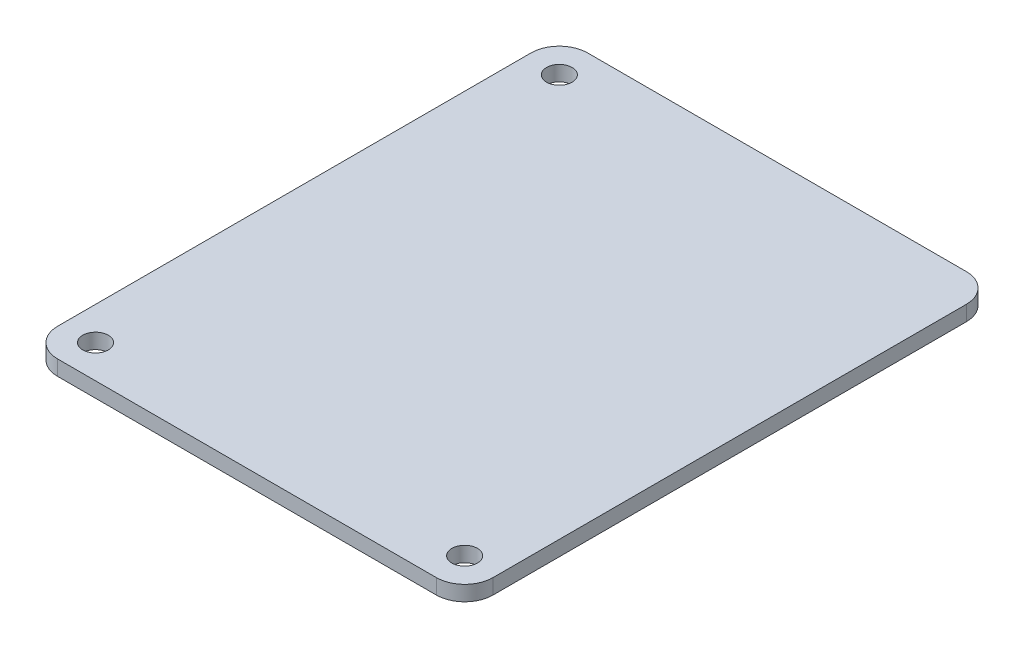
ISO-10303-21;
HEADER;
FILE_DESCRIPTION(('STEP AP214'),'2;1');
FILE_NAME('part.step','',(''),(''),'','','');
FILE_SCHEMA(('AUTOMOTIVE_DESIGN { 1 0 10303 214 1 1 1 1 }'));
ENDSEC;
DATA;
#1=APPLICATION_CONTEXT('core data for automotive mechanical design processes');
#2=APPLICATION_PROTOCOL_DEFINITION('international standard','automotive_design',2000,#1);
#3=PRODUCT_CONTEXT('',#1,'mechanical');
#4=PRODUCT('Part','Part','',(#3));
#5=PRODUCT_RELATED_PRODUCT_CATEGORY('part','',(#4));
#6=PRODUCT_DEFINITION_FORMATION('','',#4);
#7=PRODUCT_DEFINITION_CONTEXT('part definition',#1,'design');
#8=PRODUCT_DEFINITION('design','',#6,#7);
#9=PRODUCT_DEFINITION_SHAPE('','',#8);
#10=(LENGTH_UNIT() NAMED_UNIT(*) SI_UNIT(.MILLI.,.METRE.));
#11=(NAMED_UNIT(*) PLANE_ANGLE_UNIT() SI_UNIT($,.RADIAN.));
#12=(NAMED_UNIT(*) SI_UNIT($,.STERADIAN.) SOLID_ANGLE_UNIT());
#13=UNCERTAINTY_MEASURE_WITH_UNIT(LENGTH_MEASURE(1.E-05),#10,'distance_accuracy_value','');
#14=(GEOMETRIC_REPRESENTATION_CONTEXT(3) GLOBAL_UNCERTAINTY_ASSIGNED_CONTEXT((#13)) GLOBAL_UNIT_ASSIGNED_CONTEXT((#10,
#11,#12)) REPRESENTATION_CONTEXT('',''));
#15=CARTESIAN_POINT('',(0.,0.,0.));
#16=DIRECTION('',(0.,0.,1.));
#17=DIRECTION('',(1.,0.,0.));
#18=AXIS2_PLACEMENT_3D('',#15,#16,#17);
#19=CARTESIAN_POINT('',(-20.,1.6,25.));
#20=DIRECTION('',(0.,-1.,0.));
#21=DIRECTION('',(0.,0.,-1.));
#22=AXIS2_PLACEMENT_3D('',#19,#20,#21);
#23=CYLINDRICAL_SURFACE('',#22,3.);
#24=CARTESIAN_POINT('',(-20.,0.,25.));
#25=DIRECTION('',(0.,1.,0.));
#26=DIRECTION('',(0.,0.,-1.));
#27=AXIS2_PLACEMENT_3D('',#24,#25,#26);
#28=CIRCLE('',#27,3.);
#29=CARTESIAN_POINT('',(-23.,0.,25.));
#30=VERTEX_POINT('',#29);
#31=CARTESIAN_POINT('',(-20.,0.,28.));
#32=VERTEX_POINT('',#31);
#33=EDGE_CURVE('E142',#30,#32,#28,.T.);
#34=ORIENTED_EDGE('',*,*,#33,.T.);
#35=DIRECTION('',(0.,-1.,0.));
#36=VECTOR('',#35,1.);
#37=CARTESIAN_POINT('',(-20.,1.6,28.));
#38=LINE('',#37,#36);
#39=CARTESIAN_POINT('',(-20.,1.6,28.));
#40=VERTEX_POINT('',#39);
#41=EDGE_CURVE('E11',#40,#32,#38,.T.);
#42=ORIENTED_EDGE('',*,*,#41,.F.);
#43=CARTESIAN_POINT('',(-20.,1.6,25.));
#44=DIRECTION('',(0.,1.,0.));
#45=DIRECTION('',(0.,0.,-1.));
#46=AXIS2_PLACEMENT_3D('',#43,#44,#45);
#47=CIRCLE('',#46,3.);
#48=CARTESIAN_POINT('',(-23.,1.6,25.));
#49=VERTEX_POINT('',#48);
#50=EDGE_CURVE('E165',#49,#40,#47,.T.);
#51=ORIENTED_EDGE('',*,*,#50,.F.);
#52=DIRECTION('',(0.,-1.,0.));
#53=VECTOR('',#52,1.);
#54=CARTESIAN_POINT('',(-23.,1.6,25.));
#55=LINE('',#54,#53);
#56=EDGE_CURVE('E138',#49,#30,#55,.T.);
#57=ORIENTED_EDGE('',*,*,#56,.T.);
#58=EDGE_LOOP('',(#34,#42,#51,#57));
#59=FACE_BOUND('',#58,.T.);
#60=ADVANCED_FACE('F41',(#59),#23,.T.);
#61=CARTESIAN_POINT('',(-20.,1.6,28.));
#62=DIRECTION('',(0.,0.,-1.));
#63=DIRECTION('',(-1.,0.,0.));
#64=AXIS2_PLACEMENT_3D('',#61,#62,#63);
#65=PLANE('',#64);
#66=DIRECTION('',(1.,0.,0.));
#67=VECTOR('',#66,1.);
#68=CARTESIAN_POINT('',(-20.,0.,28.));
#69=LINE('',#68,#67);
#70=CARTESIAN_POINT('',(20.,0.,28.));
#71=VERTEX_POINT('',#70);
#72=EDGE_CURVE('E146',#32,#71,#69,.T.);
#73=ORIENTED_EDGE('',*,*,#72,.T.);
#74=DIRECTION('',(0.,-1.,0.));
#75=VECTOR('',#74,1.);
#76=CARTESIAN_POINT('',(20.,1.6,28.));
#77=LINE('',#76,#75);
#78=CARTESIAN_POINT('',(20.,1.6,28.));
#79=VERTEX_POINT('',#78);
#80=EDGE_CURVE('E50',#79,#71,#77,.T.);
#81=ORIENTED_EDGE('',*,*,#80,.F.);
#82=DIRECTION('',(1.,0.,0.));
#83=VECTOR('',#82,1.);
#84=CARTESIAN_POINT('',(-20.,1.6,28.));
#85=LINE('',#84,#83);
#86=EDGE_CURVE('E101',#40,#79,#85,.T.);
#87=ORIENTED_EDGE('',*,*,#86,.F.);
#88=ORIENTED_EDGE('',*,*,#41,.T.);
#89=EDGE_LOOP('',(#73,#81,#87,#88));
#90=FACE_BOUND('',#89,.T.);
#91=ADVANCED_FACE('F263',(#90),#65,.F.);
#92=CARTESIAN_POINT('',(20.,1.6,25.));
#93=DIRECTION('',(0.,-1.,0.));
#94=DIRECTION('',(0.,0.,-1.));
#95=AXIS2_PLACEMENT_3D('',#92,#93,#94);
#96=CYLINDRICAL_SURFACE('',#95,3.);
#97=CARTESIAN_POINT('',(20.,0.,25.));
#98=DIRECTION('',(0.,1.,0.));
#99=DIRECTION('',(0.,0.,1.));
#100=AXIS2_PLACEMENT_3D('',#97,#98,#99);
#101=CIRCLE('',#100,3.);
#102=CARTESIAN_POINT('',(23.,0.,25.));
#103=VERTEX_POINT('',#102);
#104=EDGE_CURVE('E150',#71,#103,#101,.T.);
#105=ORIENTED_EDGE('',*,*,#104,.T.);
#106=DIRECTION('',(0.,-1.,0.));
#107=VECTOR('',#106,1.);
#108=CARTESIAN_POINT('',(23.,1.6,25.));
#109=LINE('',#108,#107);
#110=CARTESIAN_POINT('',(23.,1.6,25.));
#111=VERTEX_POINT('',#110);
#112=EDGE_CURVE('E176',#111,#103,#109,.T.);
#113=ORIENTED_EDGE('',*,*,#112,.F.);
#114=CARTESIAN_POINT('',(20.,1.6,25.));
#115=DIRECTION('',(0.,1.,0.));
#116=DIRECTION('',(0.,0.,1.));
#117=AXIS2_PLACEMENT_3D('',#114,#115,#116);
#118=CIRCLE('',#117,3.);
#119=EDGE_CURVE('E186',#79,#111,#118,.T.);
#120=ORIENTED_EDGE('',*,*,#119,.F.);
#121=ORIENTED_EDGE('',*,*,#80,.T.);
#122=EDGE_LOOP('',(#105,#113,#120,#121));
#123=FACE_BOUND('',#122,.T.);
#124=ADVANCED_FACE('F184',(#123),#96,.T.);
#125=CARTESIAN_POINT('',(23.,1.6,25.));
#126=DIRECTION('',(-1.,0.,0.));
#127=DIRECTION('',(0.,0.,1.));
#128=AXIS2_PLACEMENT_3D('',#125,#126,#127);
#129=PLANE('',#128);
#130=DIRECTION('',(0.,0.,-1.));
#131=VECTOR('',#130,1.);
#132=CARTESIAN_POINT('',(23.,0.,25.));
#133=LINE('',#132,#131);
#134=CARTESIAN_POINT('',(23.,0.,-25.));
#135=VERTEX_POINT('',#134);
#136=EDGE_CURVE('E153',#103,#135,#133,.T.);
#137=ORIENTED_EDGE('',*,*,#136,.T.);
#138=DIRECTION('',(0.,-1.,0.));
#139=VECTOR('',#138,1.);
#140=CARTESIAN_POINT('',(23.,1.6,-25.));
#141=LINE('',#140,#139);
#142=CARTESIAN_POINT('',(23.,1.6,-25.));
#143=VERTEX_POINT('',#142);
#144=EDGE_CURVE('E172',#143,#135,#141,.T.);
#145=ORIENTED_EDGE('',*,*,#144,.F.);
#146=DIRECTION('',(0.,0.,-1.));
#147=VECTOR('',#146,1.);
#148=CARTESIAN_POINT('',(23.,1.6,25.));
#149=LINE('',#148,#147);
#150=EDGE_CURVE('E199',#111,#143,#149,.T.);
#151=ORIENTED_EDGE('',*,*,#150,.F.);
#152=ORIENTED_EDGE('',*,*,#112,.T.);
#153=EDGE_LOOP('',(#137,#145,#151,#152));
#154=FACE_BOUND('',#153,.T.);
#155=ADVANCED_FACE('F194',(#154),#129,.F.);
#156=CARTESIAN_POINT('',(20.,1.6,-25.));
#157=DIRECTION('',(0.,-1.,0.));
#158=DIRECTION('',(0.,0.,-1.));
#159=AXIS2_PLACEMENT_3D('',#156,#157,#158);
#160=CYLINDRICAL_SURFACE('',#159,3.);
#161=CARTESIAN_POINT('',(20.,0.,-25.));
#162=DIRECTION('',(0.,1.,0.));
#163=DIRECTION('',(0.,0.,-1.));
#164=AXIS2_PLACEMENT_3D('',#161,#162,#163);
#165=CIRCLE('',#164,3.);
#166=CARTESIAN_POINT('',(20.,0.,-28.));
#167=VERTEX_POINT('',#166);
#168=EDGE_CURVE('E156',#135,#167,#165,.T.);
#169=ORIENTED_EDGE('',*,*,#168,.T.);
#170=DIRECTION('',(0.,-1.,0.));
#171=VECTOR('',#170,1.);
#172=CARTESIAN_POINT('',(20.,1.6,-28.));
#173=LINE('',#172,#171);
#174=CARTESIAN_POINT('',(20.,1.6,-28.));
#175=VERTEX_POINT('',#174);
#176=EDGE_CURVE('E131',#175,#167,#173,.T.);
#177=ORIENTED_EDGE('',*,*,#176,.F.);
#178=CARTESIAN_POINT('',(20.,1.6,-25.));
#179=DIRECTION('',(0.,1.,0.));
#180=DIRECTION('',(0.,0.,-1.));
#181=AXIS2_PLACEMENT_3D('',#178,#179,#180);
#182=CIRCLE('',#181,3.);
#183=EDGE_CURVE('E120',#143,#175,#182,.T.);
#184=ORIENTED_EDGE('',*,*,#183,.F.);
#185=ORIENTED_EDGE('',*,*,#144,.T.);
#186=EDGE_LOOP('',(#169,#177,#184,#185));
#187=FACE_BOUND('',#186,.T.);
#188=ADVANCED_FACE('F197',(#187),#160,.T.);
#189=CARTESIAN_POINT('',(-20.,1.6,-28.));
#190=DIRECTION('',(0.,0.,1.));
#191=DIRECTION('',(1.,0.,0.));
#192=AXIS2_PLACEMENT_3D('',#189,#190,#191);
#193=PLANE('',#192);
#194=DIRECTION('',(-1.,0.,0.));
#195=VECTOR('',#194,1.);
#196=CARTESIAN_POINT('',(-20.,0.,-28.));
#197=LINE('',#196,#195);
#198=CARTESIAN_POINT('',(-20.,0.,-28.));
#199=VERTEX_POINT('',#198);
#200=EDGE_CURVE('E129',#167,#199,#197,.T.);
#201=ORIENTED_EDGE('',*,*,#200,.T.);
#202=DIRECTION('',(0.,-1.,0.));
#203=VECTOR('',#202,1.);
#204=CARTESIAN_POINT('',(-20.,1.6,-28.));
#205=LINE('',#204,#203);
#206=CARTESIAN_POINT('',(-20.,1.6,-28.));
#207=VERTEX_POINT('',#206);
#208=EDGE_CURVE('E126',#207,#199,#205,.T.);
#209=ORIENTED_EDGE('',*,*,#208,.F.);
#210=DIRECTION('',(-1.,0.,0.));
#211=VECTOR('',#210,1.);
#212=CARTESIAN_POINT('',(-20.,1.6,-28.));
#213=LINE('',#212,#211);
#214=EDGE_CURVE('E114',#175,#207,#213,.T.);
#215=ORIENTED_EDGE('',*,*,#214,.F.);
#216=ORIENTED_EDGE('',*,*,#176,.T.);
#217=EDGE_LOOP('',(#201,#209,#215,#216));
#218=FACE_BOUND('',#217,.T.);
#219=ADVANCED_FACE('F127',(#218),#193,.F.);
#220=CARTESIAN_POINT('',(-20.,1.6,-25.));
#221=DIRECTION('',(0.,-1.,0.));
#222=DIRECTION('',(0.,0.,-1.));
#223=AXIS2_PLACEMENT_3D('',#220,#221,#222);
#224=CYLINDRICAL_SURFACE('',#223,3.);
#225=CARTESIAN_POINT('',(-20.,0.,-25.));
#226=DIRECTION('',(0.,1.,0.));
#227=DIRECTION('',(0.,0.,-1.));
#228=AXIS2_PLACEMENT_3D('',#225,#226,#227);
#229=CIRCLE('',#228,3.);
#230=CARTESIAN_POINT('',(-23.,0.,-25.));
#231=VERTEX_POINT('',#230);
#232=EDGE_CURVE('E87',#199,#231,#229,.T.);
#233=ORIENTED_EDGE('',*,*,#232,.T.);
#234=DIRECTION('',(0.,-1.,0.));
#235=VECTOR('',#234,1.);
#236=CARTESIAN_POINT('',(-23.,1.6,-25.));
#237=LINE('',#236,#235);
#238=CARTESIAN_POINT('',(-23.,1.6,-25.));
#239=VERTEX_POINT('',#238);
#240=EDGE_CURVE('E132',#239,#231,#237,.T.);
#241=ORIENTED_EDGE('',*,*,#240,.F.);
#242=CARTESIAN_POINT('',(-20.,1.6,-25.));
#243=DIRECTION('',(0.,1.,0.));
#244=DIRECTION('',(0.,0.,-1.));
#245=AXIS2_PLACEMENT_3D('',#242,#243,#244);
#246=CIRCLE('',#245,3.);
#247=EDGE_CURVE('E118',#207,#239,#246,.T.);
#248=ORIENTED_EDGE('',*,*,#247,.F.);
#249=ORIENTED_EDGE('',*,*,#208,.T.);
#250=EDGE_LOOP('',(#233,#241,#248,#249));
#251=FACE_BOUND('',#250,.T.);
#252=ADVANCED_FACE('F134',(#251),#224,.T.);
#253=CARTESIAN_POINT('',(-23.,1.6,25.));
#254=DIRECTION('',(1.,0.,0.));
#255=DIRECTION('',(0.,0.,-1.));
#256=AXIS2_PLACEMENT_3D('',#253,#254,#255);
#257=PLANE('',#256);
#258=DIRECTION('',(0.,0.,1.));
#259=VECTOR('',#258,1.);
#260=CARTESIAN_POINT('',(-23.,0.,25.));
#261=LINE('',#260,#259);
#262=EDGE_CURVE('E93',#231,#30,#261,.T.);
#263=ORIENTED_EDGE('',*,*,#262,.T.);
#264=ORIENTED_EDGE('',*,*,#56,.F.);
#265=DIRECTION('',(0.,0.,1.));
#266=VECTOR('',#265,1.);
#267=CARTESIAN_POINT('',(-23.,1.6,25.));
#268=LINE('',#267,#266);
#269=EDGE_CURVE('E58',#239,#49,#268,.T.);
#270=ORIENTED_EDGE('',*,*,#269,.F.);
#271=ORIENTED_EDGE('',*,*,#240,.T.);
#272=EDGE_LOOP('',(#263,#264,#270,#271));
#273=FACE_BOUND('',#272,.T.);
#274=ADVANCED_FACE('F244',(#273),#257,.F.);
#275=CARTESIAN_POINT('',(-20.,1.6,25.));
#276=DIRECTION('',(0.,-1.,0.));
#277=DIRECTION('',(0.,0.,-1.));
#278=AXIS2_PLACEMENT_3D('',#275,#276,#277);
#279=PLANE('',#278);
#280=CARTESIAN_POINT('',(-19.5,1.6,-24.5));
#281=DIRECTION('',(0.,1.,0.));
#282=DIRECTION('',(0.,0.,1.));
#283=AXIS2_PLACEMENT_3D('',#280,#281,#282);
#284=CIRCLE('',#283,1.35);
#285=CARTESIAN_POINT('',(-19.5,1.6,-23.15));
#286=VERTEX_POINT('',#285);
#287=EDGE_CURVE('E225',#286,#286,#284,.T.);
#288=ORIENTED_EDGE('',*,*,#287,.F.);
#289=EDGE_LOOP('',(#288));
#290=FACE_BOUND('',#289,.T.);
#291=CARTESIAN_POINT('',(19.5,1.6,24.5));
#292=DIRECTION('',(0.,1.,0.));
#293=DIRECTION('',(0.,0.,1.));
#294=AXIS2_PLACEMENT_3D('',#291,#292,#293);
#295=CIRCLE('',#294,1.35);
#296=CARTESIAN_POINT('',(19.5,1.6,25.85));
#297=VERTEX_POINT('',#296);
#298=EDGE_CURVE('E217',#297,#297,#295,.T.);
#299=ORIENTED_EDGE('',*,*,#298,.F.);
#300=EDGE_LOOP('',(#299));
#301=FACE_BOUND('',#300,.T.);
#302=CARTESIAN_POINT('',(-19.5,1.6,24.5));
#303=DIRECTION('',(0.,1.,0.));
#304=DIRECTION('',(0.,0.,-1.));
#305=AXIS2_PLACEMENT_3D('',#302,#303,#304);
#306=CIRCLE('',#305,1.35);
#307=CARTESIAN_POINT('',(-19.5,1.6,23.15));
#308=VERTEX_POINT('',#307);
#309=EDGE_CURVE('E209',#308,#308,#306,.T.);
#310=ORIENTED_EDGE('',*,*,#309,.F.);
#311=EDGE_LOOP('',(#310));
#312=FACE_BOUND('',#311,.T.);
#313=ORIENTED_EDGE('',*,*,#50,.T.);
#314=ORIENTED_EDGE('',*,*,#86,.T.);
#315=ORIENTED_EDGE('',*,*,#119,.T.);
#316=ORIENTED_EDGE('',*,*,#150,.T.);
#317=ORIENTED_EDGE('',*,*,#183,.T.);
#318=ORIENTED_EDGE('',*,*,#214,.T.);
#319=ORIENTED_EDGE('',*,*,#247,.T.);
#320=ORIENTED_EDGE('',*,*,#269,.T.);
#321=EDGE_LOOP('',(#313,#314,#315,#316,#317,#318,#319,#320));
#322=FACE_BOUND('',#321,.T.);
#323=ADVANCED_FACE('F116',(#290,#301,#312,#322),#279,.F.);
#324=CARTESIAN_POINT('',(-20.,0.,25.));
#325=DIRECTION('',(0.,-1.,0.));
#326=DIRECTION('',(0.,0.,-1.));
#327=AXIS2_PLACEMENT_3D('',#324,#325,#326);
#328=PLANE('',#327);
#329=CARTESIAN_POINT('',(-19.5,0.,-24.5));
#330=DIRECTION('',(0.,1.,0.));
#331=DIRECTION('',(0.,0.,1.));
#332=AXIS2_PLACEMENT_3D('',#329,#330,#331);
#333=CIRCLE('',#332,1.35);
#334=CARTESIAN_POINT('',(-19.5,0.,-23.15));
#335=VERTEX_POINT('',#334);
#336=EDGE_CURVE('E147',#335,#335,#333,.T.);
#337=ORIENTED_EDGE('',*,*,#336,.T.);
#338=EDGE_LOOP('',(#337));
#339=FACE_BOUND('',#338,.T.);
#340=CARTESIAN_POINT('',(19.5,0.,24.5));
#341=DIRECTION('',(0.,1.,0.));
#342=DIRECTION('',(0.,0.,1.));
#343=AXIS2_PLACEMENT_3D('',#340,#341,#342);
#344=CIRCLE('',#343,1.35);
#345=CARTESIAN_POINT('',(19.5,0.,25.85));
#346=VERTEX_POINT('',#345);
#347=EDGE_CURVE('E221',#346,#346,#344,.T.);
#348=ORIENTED_EDGE('',*,*,#347,.T.);
#349=EDGE_LOOP('',(#348));
#350=FACE_BOUND('',#349,.T.);
#351=CARTESIAN_POINT('',(-19.5,0.,24.5));
#352=DIRECTION('',(0.,1.,0.));
#353=DIRECTION('',(0.,0.,-1.));
#354=AXIS2_PLACEMENT_3D('',#351,#352,#353);
#355=CIRCLE('',#354,1.35);
#356=CARTESIAN_POINT('',(-19.5,0.,23.15));
#357=VERTEX_POINT('',#356);
#358=EDGE_CURVE('E213',#357,#357,#355,.T.);
#359=ORIENTED_EDGE('',*,*,#358,.T.);
#360=EDGE_LOOP('',(#359));
#361=FACE_BOUND('',#360,.T.);
#362=ORIENTED_EDGE('',*,*,#33,.F.);
#363=ORIENTED_EDGE('',*,*,#262,.F.);
#364=ORIENTED_EDGE('',*,*,#232,.F.);
#365=ORIENTED_EDGE('',*,*,#200,.F.);
#366=ORIENTED_EDGE('',*,*,#168,.F.);
#367=ORIENTED_EDGE('',*,*,#136,.F.);
#368=ORIENTED_EDGE('',*,*,#104,.F.);
#369=ORIENTED_EDGE('',*,*,#72,.F.);
#370=EDGE_LOOP('',(#362,#363,#364,#365,#366,#367,#368,#369));
#371=FACE_BOUND('',#370,.T.);
#372=ADVANCED_FACE('F190',(#339,#350,#361,#371),#328,.T.);
#373=CARTESIAN_POINT('',(-19.5,0.,24.5));
#374=DIRECTION('',(0.,1.,0.));
#375=DIRECTION('',(0.,0.,1.));
#376=AXIS2_PLACEMENT_3D('',#373,#374,#375);
#377=CYLINDRICAL_SURFACE('',#376,1.35);
#378=ORIENTED_EDGE('',*,*,#358,.F.);
#379=EDGE_LOOP('',(#378));
#380=FACE_BOUND('',#379,.T.);
#381=ORIENTED_EDGE('',*,*,#309,.T.);
#382=EDGE_LOOP('',(#381));
#383=FACE_BOUND('',#382,.T.);
#384=ADVANCED_FACE('F250',(#380,#383),#377,.F.);
#385=CARTESIAN_POINT('',(19.5,0.,24.5));
#386=DIRECTION('',(0.,1.,0.));
#387=DIRECTION('',(0.,0.,1.));
#388=AXIS2_PLACEMENT_3D('',#385,#386,#387);
#389=CYLINDRICAL_SURFACE('',#388,1.35);
#390=ORIENTED_EDGE('',*,*,#347,.F.);
#391=EDGE_LOOP('',(#390));
#392=FACE_BOUND('',#391,.T.);
#393=ORIENTED_EDGE('',*,*,#298,.T.);
#394=EDGE_LOOP('',(#393));
#395=FACE_BOUND('',#394,.T.);
#396=ADVANCED_FACE('F238',(#392,#395),#389,.F.);
#397=CARTESIAN_POINT('',(-19.5,0.,-24.5));
#398=DIRECTION('',(0.,1.,0.));
#399=DIRECTION('',(0.,0.,1.));
#400=AXIS2_PLACEMENT_3D('',#397,#398,#399);
#401=CYLINDRICAL_SURFACE('',#400,1.35);
#402=ORIENTED_EDGE('',*,*,#336,.F.);
#403=EDGE_LOOP('',(#402));
#404=FACE_BOUND('',#403,.T.);
#405=ORIENTED_EDGE('',*,*,#287,.T.);
#406=EDGE_LOOP('',(#405));
#407=FACE_BOUND('',#406,.T.);
#408=ADVANCED_FACE('F235',(#404,#407),#401,.F.);
#409=CLOSED_SHELL('',(#60,#91,#124,#155,#188,#219,#252,#274,#323,#372,#384,#396,#408));
#410=MANIFOLD_SOLID_BREP('B2',#409);
#411=ADVANCED_BREP_SHAPE_REPRESENTATION('',(#18,#410),#14);
#412=SHAPE_DEFINITION_REPRESENTATION(#9,#411);
ENDSEC;
END-ISO-10303-21;
